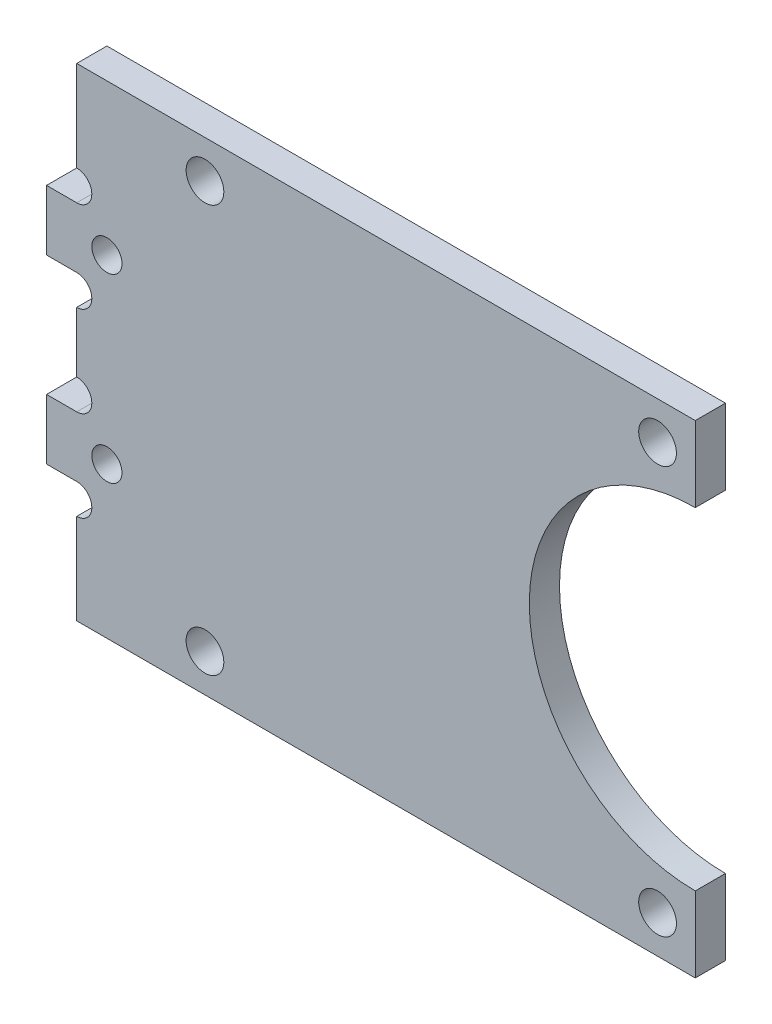
ISO-10303-21;
HEADER;
FILE_DESCRIPTION(('STEP AP214'),'2;1');
FILE_NAME('part.step','',(''),(''),'','','');
FILE_SCHEMA(('AUTOMOTIVE_DESIGN { 1 0 10303 214 1 1 1 1 }'));
ENDSEC;
DATA;
#1=APPLICATION_CONTEXT('core data for automotive mechanical design processes');
#2=APPLICATION_PROTOCOL_DEFINITION('international standard','automotive_design',2000,#1);
#3=PRODUCT_CONTEXT('',#1,'mechanical');
#4=PRODUCT('Part','Part','',(#3));
#5=PRODUCT_RELATED_PRODUCT_CATEGORY('part','',(#4));
#6=PRODUCT_DEFINITION_FORMATION('','',#4);
#7=PRODUCT_DEFINITION_CONTEXT('part definition',#1,'design');
#8=PRODUCT_DEFINITION('design','',#6,#7);
#9=PRODUCT_DEFINITION_SHAPE('','',#8);
#10=(LENGTH_UNIT() NAMED_UNIT(*) SI_UNIT(.MILLI.,.METRE.));
#11=(NAMED_UNIT(*) PLANE_ANGLE_UNIT() SI_UNIT($,.RADIAN.));
#12=(NAMED_UNIT(*) SI_UNIT($,.STERADIAN.) SOLID_ANGLE_UNIT());
#13=UNCERTAINTY_MEASURE_WITH_UNIT(LENGTH_MEASURE(1.E-05),#10,'distance_accuracy_value','');
#14=(GEOMETRIC_REPRESENTATION_CONTEXT(3) GLOBAL_UNCERTAINTY_ASSIGNED_CONTEXT((#13)) GLOBAL_UNIT_ASSIGNED_CONTEXT((#10,
#11,#12)) REPRESENTATION_CONTEXT('',''));
#15=CARTESIAN_POINT('',(0.,0.,0.));
#16=DIRECTION('',(0.,0.,1.));
#17=DIRECTION('',(1.,0.,0.));
#18=AXIS2_PLACEMENT_3D('',#15,#16,#17);
#19=CARTESIAN_POINT('',(15.2837868020581,10.1625,2.));
#20=DIRECTION('',(-1.,0.,0.));
#21=DIRECTION('',(0.,-1.,0.));
#22=AXIS2_PLACEMENT_3D('',#19,#20,#21);
#23=PLANE('',#22);
#24=DIRECTION('',(0.,1.,0.));
#25=VECTOR('',#24,1.);
#26=CARTESIAN_POINT('',(15.2837868020581,10.1625,2.));
#27=LINE('',#26,#25);
#28=CARTESIAN_POINT('',(15.2837868020581,5.1625,2.));
#29=VERTEX_POINT('',#28);
#30=CARTESIAN_POINT('',(15.2837868020581,10.1625,2.));
#31=VERTEX_POINT('',#30);
#32=EDGE_CURVE('E55',#29,#31,#27,.T.);
#33=ORIENTED_EDGE('',*,*,#32,.F.);
#34=DIRECTION('',(0.,0.,-1.));
#35=VECTOR('',#34,1.);
#36=CARTESIAN_POINT('',(15.2837868020581,5.1625,10.));
#37=LINE('',#36,#35);
#38=CARTESIAN_POINT('',(15.2837868020581,5.1625,0.));
#39=VERTEX_POINT('',#38);
#40=EDGE_CURVE('E11',#29,#39,#37,.T.);
#41=ORIENTED_EDGE('',*,*,#40,.T.);
#42=DIRECTION('',(0.,1.,0.));
#43=VECTOR('',#42,1.);
#44=CARTESIAN_POINT('',(15.2837868020581,10.1625,0.));
#45=LINE('',#44,#43);
#46=CARTESIAN_POINT('',(15.2837868020581,10.1625,0.));
#47=VERTEX_POINT('',#46);
#48=EDGE_CURVE('E113',#39,#47,#45,.T.);
#49=ORIENTED_EDGE('',*,*,#48,.T.);
#50=DIRECTION('',(0.,0.,-1.));
#51=VECTOR('',#50,1.);
#52=CARTESIAN_POINT('',(15.2837868020581,10.1625,2.));
#53=LINE('',#52,#51);
#54=EDGE_CURVE('E190',#31,#47,#53,.T.);
#55=ORIENTED_EDGE('',*,*,#54,.F.);
#56=EDGE_LOOP('',(#33,#41,#49,#55));
#57=FACE_BOUND('',#56,.T.);
#58=ADVANCED_FACE('F32',(#57),#23,.F.);
#59=CARTESIAN_POINT('',(-25.7162131979419,3.1625,2.));
#60=DIRECTION('',(0.,0.,1.));
#61=DIRECTION('',(1.,0.,0.));
#62=AXIS2_PLACEMENT_3D('',#59,#60,#61);
#63=PLANE('',#62);
#64=CARTESIAN_POINT('',(15.2837868020581,-5.8375,2.));
#65=DIRECTION('',(0.,0.,1.));
#66=DIRECTION('',(1.,0.,0.));
#67=AXIS2_PLACEMENT_3D('',#64,#65,#66);
#68=CIRCLE('',#67,11.);
#69=CARTESIAN_POINT('',(15.2837868020581,-16.8375,2.));
#70=VERTEX_POINT('',#69);
#71=EDGE_CURVE('E47',#29,#70,#68,.T.);
#72=ORIENTED_EDGE('',*,*,#71,.F.);
#73=ORIENTED_EDGE('',*,*,#32,.T.);
#74=DIRECTION('',(-1.,0.,0.));
#75=VECTOR('',#74,1.);
#76=CARTESIAN_POINT('',(-17.2162131979419,10.1625,2.));
#77=LINE('',#76,#75);
#78=CARTESIAN_POINT('',(-25.7162131979419,10.1625,2.));
#79=VERTEX_POINT('',#78);
#80=EDGE_CURVE('E118',#31,#79,#77,.T.);
#81=ORIENTED_EDGE('',*,*,#80,.T.);
#82=DIRECTION('',(0.,-1.,0.));
#83=VECTOR('',#82,1.);
#84=CARTESIAN_POINT('',(-25.7162131979419,10.1625,2.));
#85=LINE('',#84,#83);
#86=CARTESIAN_POINT('',(-25.7162131979419,4.1625,2.));
#87=VERTEX_POINT('',#86);
#88=EDGE_CURVE('E291',#79,#87,#85,.T.);
#89=ORIENTED_EDGE('',*,*,#88,.T.);
#90=CARTESIAN_POINT('',(-25.7162131979419,3.1625,2.));
#91=DIRECTION('',(0.,0.,-1.));
#92=DIRECTION('',(1.,0.,0.));
#93=AXIS2_PLACEMENT_3D('',#90,#91,#92);
#94=CIRCLE('',#93,1.);
#95=CARTESIAN_POINT('',(-25.7162131979419,2.1625,2.));
#96=VERTEX_POINT('',#95);
#97=EDGE_CURVE('E288',#87,#96,#94,.T.);
#98=ORIENTED_EDGE('',*,*,#97,.T.);
#99=DIRECTION('',(-1.,0.,0.));
#100=VECTOR('',#99,1.);
#101=CARTESIAN_POINT('',(-25.7162131979419,2.1625,2.));
#102=LINE('',#101,#100);
#103=CARTESIAN_POINT('',(-27.7162131979419,2.1625,2.));
#104=VERTEX_POINT('',#103);
#105=EDGE_CURVE('E290',#96,#104,#102,.T.);
#106=ORIENTED_EDGE('',*,*,#105,.T.);
#107=DIRECTION('',(0.,-1.,0.));
#108=VECTOR('',#107,1.);
#109=CARTESIAN_POINT('',(-27.7162131979419,2.1625,2.));
#110=LINE('',#109,#108);
#111=CARTESIAN_POINT('',(-27.7162131979419,-1.8375,2.));
#112=VERTEX_POINT('',#111);
#113=EDGE_CURVE('E293',#104,#112,#110,.T.);
#114=ORIENTED_EDGE('',*,*,#113,.T.);
#115=DIRECTION('',(1.,0.,0.));
#116=VECTOR('',#115,1.);
#117=CARTESIAN_POINT('',(-25.7162131979419,-1.8375,2.));
#118=LINE('',#117,#116);
#119=CARTESIAN_POINT('',(-25.7162131979419,-1.8375,2.));
#120=VERTEX_POINT('',#119);
#121=EDGE_CURVE('E299',#112,#120,#118,.T.);
#122=ORIENTED_EDGE('',*,*,#121,.T.);
#123=CARTESIAN_POINT('',(-25.7162131979419,-2.8375,2.));
#124=DIRECTION('',(0.,0.,-1.));
#125=DIRECTION('',(-1.,0.,0.));
#126=AXIS2_PLACEMENT_3D('',#123,#124,#125);
#127=CIRCLE('',#126,1.);
#128=CARTESIAN_POINT('',(-25.7162131979419,-3.8375,2.));
#129=VERTEX_POINT('',#128);
#130=EDGE_CURVE('E301',#120,#129,#127,.T.);
#131=ORIENTED_EDGE('',*,*,#130,.T.);
#132=DIRECTION('',(0.,-1.,0.));
#133=VECTOR('',#132,1.);
#134=CARTESIAN_POINT('',(-25.7162131979419,-3.8375,2.));
#135=LINE('',#134,#133);
#136=CARTESIAN_POINT('',(-25.7162131979419,-7.8375,2.));
#137=VERTEX_POINT('',#136);
#138=EDGE_CURVE('E303',#129,#137,#135,.T.);
#139=ORIENTED_EDGE('',*,*,#138,.T.);
#140=CARTESIAN_POINT('',(-25.7162131979419,-8.8375,2.));
#141=DIRECTION('',(0.,0.,-1.));
#142=DIRECTION('',(1.,0.,0.));
#143=AXIS2_PLACEMENT_3D('',#140,#141,#142);
#144=CIRCLE('',#143,1.);
#145=CARTESIAN_POINT('',(-25.7162131979419,-9.8375,2.));
#146=VERTEX_POINT('',#145);
#147=EDGE_CURVE('E305',#137,#146,#144,.T.);
#148=ORIENTED_EDGE('',*,*,#147,.T.);
#149=DIRECTION('',(-1.,0.,0.));
#150=VECTOR('',#149,1.);
#151=CARTESIAN_POINT('',(-25.7162131979419,-9.8375,2.));
#152=LINE('',#151,#150);
#153=CARTESIAN_POINT('',(-27.7162131979419,-9.8375,2.));
#154=VERTEX_POINT('',#153);
#155=EDGE_CURVE('E307',#146,#154,#152,.T.);
#156=ORIENTED_EDGE('',*,*,#155,.T.);
#157=DIRECTION('',(0.,-1.,0.));
#158=VECTOR('',#157,1.);
#159=CARTESIAN_POINT('',(-27.7162131979419,-9.8375,2.));
#160=LINE('',#159,#158);
#161=CARTESIAN_POINT('',(-27.7162131979419,-13.8375,2.));
#162=VERTEX_POINT('',#161);
#163=EDGE_CURVE('E309',#154,#162,#160,.T.);
#164=ORIENTED_EDGE('',*,*,#163,.T.);
#165=DIRECTION('',(1.,0.,0.));
#166=VECTOR('',#165,1.);
#167=CARTESIAN_POINT('',(-25.7162131979419,-13.8375,2.));
#168=LINE('',#167,#166);
#169=CARTESIAN_POINT('',(-25.7162131979419,-13.8375,2.));
#170=VERTEX_POINT('',#169);
#171=EDGE_CURVE('E311',#162,#170,#168,.T.);
#172=ORIENTED_EDGE('',*,*,#171,.T.);
#173=CARTESIAN_POINT('',(-25.7162131979419,-14.8375,2.));
#174=DIRECTION('',(0.,0.,-1.));
#175=DIRECTION('',(-1.,0.,0.));
#176=AXIS2_PLACEMENT_3D('',#173,#174,#175);
#177=CIRCLE('',#176,0.999999999999999);
#178=CARTESIAN_POINT('',(-25.7162131979419,-15.8375,2.));
#179=VERTEX_POINT('',#178);
#180=EDGE_CURVE('E167',#170,#179,#177,.T.);
#181=ORIENTED_EDGE('',*,*,#180,.T.);
#182=DIRECTION('',(0.,-1.,0.));
#183=VECTOR('',#182,1.);
#184=CARTESIAN_POINT('',(-25.7162131979419,-15.8375,2.));
#185=LINE('',#184,#183);
#186=CARTESIAN_POINT('',(-25.7162131979419,-21.8375,2.));
#187=VERTEX_POINT('',#186);
#188=EDGE_CURVE('E158',#179,#187,#185,.T.);
#189=ORIENTED_EDGE('',*,*,#188,.T.);
#190=DIRECTION('',(1.,0.,0.));
#191=VECTOR('',#190,1.);
#192=CARTESIAN_POINT('',(-19.7162131979419,-21.8375,2.));
#193=LINE('',#192,#191);
#194=CARTESIAN_POINT('',(15.2837868020581,-21.8375,2.));
#195=VERTEX_POINT('',#194);
#196=EDGE_CURVE('E164',#187,#195,#193,.T.);
#197=ORIENTED_EDGE('',*,*,#196,.T.);
#198=EDGE_CURVE('E186',#195,#70,#27,.T.);
#199=ORIENTED_EDGE('',*,*,#198,.T.);
#200=EDGE_LOOP('',(#72,#73,#81,#89,#98,#106,#114,#122,#131,#139,#148,#156,#164,#172,#181,#189,
#197,#199));
#201=FACE_BOUND('',#200,.T.);
#202=CARTESIAN_POINT('',(-23.7162131979419,0.162500000000001,2.));
#203=DIRECTION('',(0.,0.,1.));
#204=DIRECTION('',(1.,0.,0.));
#205=AXIS2_PLACEMENT_3D('',#202,#203,#204);
#206=CIRCLE('',#205,1.);
#207=CARTESIAN_POINT('',(-22.7162131979419,0.162500000000001,2.));
#208=VERTEX_POINT('',#207);
#209=EDGE_CURVE('E330',#208,#208,#206,.T.);
#210=ORIENTED_EDGE('',*,*,#209,.F.);
#211=EDGE_LOOP('',(#210));
#212=FACE_BOUND('',#211,.T.);
#213=CARTESIAN_POINT('',(12.7837868020581,7.6625,2.));
#214=DIRECTION('',(0.,0.,1.));
#215=DIRECTION('',(1.,0.,0.));
#216=AXIS2_PLACEMENT_3D('',#213,#214,#215);
#217=CIRCLE('',#216,1.25);
#218=CARTESIAN_POINT('',(14.0337868020581,7.6625,2.));
#219=VERTEX_POINT('',#218);
#220=EDGE_CURVE('E342',#219,#219,#217,.T.);
#221=ORIENTED_EDGE('',*,*,#220,.F.);
#222=EDGE_LOOP('',(#221));
#223=FACE_BOUND('',#222,.T.);
#224=CARTESIAN_POINT('',(-17.2162131979419,7.6625,2.));
#225=DIRECTION('',(0.,0.,1.));
#226=DIRECTION('',(1.,0.,0.));
#227=AXIS2_PLACEMENT_3D('',#224,#225,#226);
#228=CIRCLE('',#227,1.25);
#229=CARTESIAN_POINT('',(-15.9662131979419,7.6625,2.));
#230=VERTEX_POINT('',#229);
#231=EDGE_CURVE('E194',#230,#230,#228,.T.);
#232=ORIENTED_EDGE('',*,*,#231,.F.);
#233=EDGE_LOOP('',(#232));
#234=FACE_BOUND('',#233,.T.);
#235=CARTESIAN_POINT('',(12.7837868020581,-19.3375,2.));
#236=DIRECTION('',(0.,0.,1.));
#237=DIRECTION('',(1.,0.,0.));
#238=AXIS2_PLACEMENT_3D('',#235,#236,#237);
#239=CIRCLE('',#238,1.25);
#240=CARTESIAN_POINT('',(14.0337868020581,-19.3375,2.));
#241=VERTEX_POINT('',#240);
#242=EDGE_CURVE('E348',#241,#241,#239,.T.);
#243=ORIENTED_EDGE('',*,*,#242,.F.);
#244=EDGE_LOOP('',(#243));
#245=FACE_BOUND('',#244,.T.);
#246=CARTESIAN_POINT('',(-17.2162131979419,-19.3375,2.));
#247=DIRECTION('',(0.,0.,1.));
#248=DIRECTION('',(1.,0.,0.));
#249=AXIS2_PLACEMENT_3D('',#246,#247,#248);
#250=CIRCLE('',#249,1.25);
#251=CARTESIAN_POINT('',(-15.9662131979419,-19.3375,2.));
#252=VERTEX_POINT('',#251);
#253=EDGE_CURVE('E336',#252,#252,#250,.T.);
#254=ORIENTED_EDGE('',*,*,#253,.F.);
#255=EDGE_LOOP('',(#254));
#256=FACE_BOUND('',#255,.T.);
#257=CARTESIAN_POINT('',(-23.7162131979419,-11.8375,2.));
#258=DIRECTION('',(0.,0.,1.));
#259=DIRECTION('',(1.,0.,0.));
#260=AXIS2_PLACEMENT_3D('',#257,#258,#259);
#261=CIRCLE('',#260,1.);
#262=CARTESIAN_POINT('',(-22.7162131979419,-11.8375,2.));
#263=VERTEX_POINT('',#262);
#264=EDGE_CURVE('E324',#263,#263,#261,.T.);
#265=ORIENTED_EDGE('',*,*,#264,.F.);
#266=EDGE_LOOP('',(#265));
#267=FACE_BOUND('',#266,.T.);
#268=ADVANCED_FACE('F160',(#201,#212,#223,#234,#245,#256,#267),#63,.T.);
#269=CARTESIAN_POINT('',(-25.7162131979419,3.1625,0.));
#270=DIRECTION('',(0.,0.,1.));
#271=DIRECTION('',(1.,0.,0.));
#272=AXIS2_PLACEMENT_3D('',#269,#270,#271);
#273=PLANE('',#272);
#274=ORIENTED_EDGE('',*,*,#48,.F.);
#275=CARTESIAN_POINT('',(15.2837868020581,-5.8375,0.));
#276=DIRECTION('',(0.,0.,-1.));
#277=DIRECTION('',(1.,0.,0.));
#278=AXIS2_PLACEMENT_3D('',#275,#276,#277);
#279=CIRCLE('',#278,11.);
#280=CARTESIAN_POINT('',(15.2837868020581,-16.8375,0.));
#281=VERTEX_POINT('',#280);
#282=EDGE_CURVE('E269',#281,#39,#279,.T.);
#283=ORIENTED_EDGE('',*,*,#282,.F.);
#284=CARTESIAN_POINT('',(15.2837868020581,-21.8375,0.));
#285=VERTEX_POINT('',#284);
#286=EDGE_CURVE('E219',#285,#281,#45,.T.);
#287=ORIENTED_EDGE('',*,*,#286,.F.);
#288=DIRECTION('',(1.,0.,0.));
#289=VECTOR('',#288,1.);
#290=CARTESIAN_POINT('',(15.2837868020581,-21.8375,0.));
#291=LINE('',#290,#289);
#292=CARTESIAN_POINT('',(-25.7162131979419,-21.8375,0.));
#293=VERTEX_POINT('',#292);
#294=EDGE_CURVE('E217',#293,#285,#291,.T.);
#295=ORIENTED_EDGE('',*,*,#294,.F.);
#296=DIRECTION('',(0.,-1.,0.));
#297=VECTOR('',#296,1.);
#298=CARTESIAN_POINT('',(-25.7162131979419,-15.8375,0.));
#299=LINE('',#298,#297);
#300=CARTESIAN_POINT('',(-25.7162131979419,-15.8375,0.));
#301=VERTEX_POINT('',#300);
#302=EDGE_CURVE('E177',#301,#293,#299,.T.);
#303=ORIENTED_EDGE('',*,*,#302,.F.);
#304=CARTESIAN_POINT('',(-25.7162131979419,-14.8375,0.));
#305=DIRECTION('',(0.,0.,-1.));
#306=DIRECTION('',(-1.,0.,0.));
#307=AXIS2_PLACEMENT_3D('',#304,#305,#306);
#308=CIRCLE('',#307,0.999999999999999);
#309=CARTESIAN_POINT('',(-25.7162131979419,-13.8375,0.));
#310=VERTEX_POINT('',#309);
#311=EDGE_CURVE('E214',#310,#301,#308,.T.);
#312=ORIENTED_EDGE('',*,*,#311,.F.);
#313=DIRECTION('',(1.,0.,0.));
#314=VECTOR('',#313,1.);
#315=CARTESIAN_POINT('',(-25.7162131979419,-13.8375,0.));
#316=LINE('',#315,#314);
#317=CARTESIAN_POINT('',(-27.7162131979419,-13.8375,0.));
#318=VERTEX_POINT('',#317);
#319=EDGE_CURVE('E212',#318,#310,#316,.T.);
#320=ORIENTED_EDGE('',*,*,#319,.F.);
#321=DIRECTION('',(0.,-1.,0.));
#322=VECTOR('',#321,1.);
#323=CARTESIAN_POINT('',(-27.7162131979419,-9.8375,0.));
#324=LINE('',#323,#322);
#325=CARTESIAN_POINT('',(-27.7162131979419,-9.8375,0.));
#326=VERTEX_POINT('',#325);
#327=EDGE_CURVE('E210',#326,#318,#324,.T.);
#328=ORIENTED_EDGE('',*,*,#327,.F.);
#329=DIRECTION('',(-1.,0.,0.));
#330=VECTOR('',#329,1.);
#331=CARTESIAN_POINT('',(-25.7162131979419,-9.8375,0.));
#332=LINE('',#331,#330);
#333=CARTESIAN_POINT('',(-25.7162131979419,-9.8375,0.));
#334=VERTEX_POINT('',#333);
#335=EDGE_CURVE('E208',#334,#326,#332,.T.);
#336=ORIENTED_EDGE('',*,*,#335,.F.);
#337=CARTESIAN_POINT('',(-25.7162131979419,-8.8375,0.));
#338=DIRECTION('',(0.,0.,-1.));
#339=DIRECTION('',(1.,0.,0.));
#340=AXIS2_PLACEMENT_3D('',#337,#338,#339);
#341=CIRCLE('',#340,1.);
#342=CARTESIAN_POINT('',(-25.7162131979419,-7.8375,0.));
#343=VERTEX_POINT('',#342);
#344=EDGE_CURVE('E206',#343,#334,#341,.T.);
#345=ORIENTED_EDGE('',*,*,#344,.F.);
#346=DIRECTION('',(0.,-1.,0.));
#347=VECTOR('',#346,1.);
#348=CARTESIAN_POINT('',(-25.7162131979419,-3.8375,0.));
#349=LINE('',#348,#347);
#350=CARTESIAN_POINT('',(-25.7162131979419,-3.8375,0.));
#351=VERTEX_POINT('',#350);
#352=EDGE_CURVE('E204',#351,#343,#349,.T.);
#353=ORIENTED_EDGE('',*,*,#352,.F.);
#354=CARTESIAN_POINT('',(-25.7162131979419,-2.8375,0.));
#355=DIRECTION('',(0.,0.,-1.));
#356=DIRECTION('',(-1.,0.,0.));
#357=AXIS2_PLACEMENT_3D('',#354,#355,#356);
#358=CIRCLE('',#357,1.);
#359=CARTESIAN_POINT('',(-25.7162131979419,-1.8375,0.));
#360=VERTEX_POINT('',#359);
#361=EDGE_CURVE('E202',#360,#351,#358,.T.);
#362=ORIENTED_EDGE('',*,*,#361,.F.);
#363=DIRECTION('',(1.,0.,0.));
#364=VECTOR('',#363,1.);
#365=CARTESIAN_POINT('',(-25.7162131979419,-1.8375,0.));
#366=LINE('',#365,#364);
#367=CARTESIAN_POINT('',(-27.7162131979419,-1.8375,0.));
#368=VERTEX_POINT('',#367);
#369=EDGE_CURVE('E200',#368,#360,#366,.T.);
#370=ORIENTED_EDGE('',*,*,#369,.F.);
#371=DIRECTION('',(0.,-1.,0.));
#372=VECTOR('',#371,1.);
#373=CARTESIAN_POINT('',(-27.7162131979419,2.1625,0.));
#374=LINE('',#373,#372);
#375=CARTESIAN_POINT('',(-27.7162131979419,2.1625,0.));
#376=VERTEX_POINT('',#375);
#377=EDGE_CURVE('E198',#376,#368,#374,.T.);
#378=ORIENTED_EDGE('',*,*,#377,.F.);
#379=DIRECTION('',(-1.,0.,0.));
#380=VECTOR('',#379,1.);
#381=CARTESIAN_POINT('',(-25.7162131979419,2.1625,0.));
#382=LINE('',#381,#380);
#383=CARTESIAN_POINT('',(-25.7162131979419,2.1625,0.));
#384=VERTEX_POINT('',#383);
#385=EDGE_CURVE('E196',#384,#376,#382,.T.);
#386=ORIENTED_EDGE('',*,*,#385,.F.);
#387=CARTESIAN_POINT('',(-25.7162131979419,3.1625,0.));
#388=DIRECTION('',(0.,0.,-1.));
#389=DIRECTION('',(1.,0.,0.));
#390=AXIS2_PLACEMENT_3D('',#387,#388,#389);
#391=CIRCLE('',#390,1.);
#392=CARTESIAN_POINT('',(-25.7162131979419,4.1625,0.));
#393=VERTEX_POINT('',#392);
#394=EDGE_CURVE('E193',#393,#384,#391,.T.);
#395=ORIENTED_EDGE('',*,*,#394,.F.);
#396=DIRECTION('',(0.,-1.,0.));
#397=VECTOR('',#396,1.);
#398=CARTESIAN_POINT('',(-25.7162131979419,10.1625,0.));
#399=LINE('',#398,#397);
#400=CARTESIAN_POINT('',(-25.7162131979419,10.1625,0.));
#401=VERTEX_POINT('',#400);
#402=EDGE_CURVE('E191',#401,#393,#399,.T.);
#403=ORIENTED_EDGE('',*,*,#402,.F.);
#404=DIRECTION('',(-1.,0.,0.));
#405=VECTOR('',#404,1.);
#406=CARTESIAN_POINT('',(-17.2162131979419,10.1625,0.));
#407=LINE('',#406,#405);
#408=EDGE_CURVE('E222',#47,#401,#407,.T.);
#409=ORIENTED_EDGE('',*,*,#408,.F.);
#410=EDGE_LOOP('',(#274,#283,#287,#295,#303,#312,#320,#328,#336,#345,#353,#362,#370,#378,#386,
#395,#403,#409));
#411=FACE_BOUND('',#410,.T.);
#412=CARTESIAN_POINT('',(-17.2162131979419,7.6625,0.));
#413=DIRECTION('',(0.,0.,1.));
#414=DIRECTION('',(1.,0.,0.));
#415=AXIS2_PLACEMENT_3D('',#412,#413,#414);
#416=CIRCLE('',#415,1.25);
#417=CARTESIAN_POINT('',(-15.9662131979419,7.6625,0.));
#418=VERTEX_POINT('',#417);
#419=EDGE_CURVE('E351',#418,#418,#416,.T.);
#420=ORIENTED_EDGE('',*,*,#419,.T.);
#421=EDGE_LOOP('',(#420));
#422=FACE_BOUND('',#421,.T.);
#423=CARTESIAN_POINT('',(12.7837868020581,-19.3375,0.));
#424=DIRECTION('',(0.,0.,1.));
#425=DIRECTION('',(1.,0.,0.));
#426=AXIS2_PLACEMENT_3D('',#423,#424,#425);
#427=CIRCLE('',#426,1.25);
#428=CARTESIAN_POINT('',(14.0337868020581,-19.3375,0.));
#429=VERTEX_POINT('',#428);
#430=EDGE_CURVE('E345',#429,#429,#427,.T.);
#431=ORIENTED_EDGE('',*,*,#430,.T.);
#432=EDGE_LOOP('',(#431));
#433=FACE_BOUND('',#432,.T.);
#434=CARTESIAN_POINT('',(12.7837868020581,7.6625,0.));
#435=DIRECTION('',(0.,0.,1.));
#436=DIRECTION('',(1.,0.,0.));
#437=AXIS2_PLACEMENT_3D('',#434,#435,#436);
#438=CIRCLE('',#437,1.25);
#439=CARTESIAN_POINT('',(14.0337868020581,7.6625,0.));
#440=VERTEX_POINT('',#439);
#441=EDGE_CURVE('E339',#440,#440,#438,.T.);
#442=ORIENTED_EDGE('',*,*,#441,.T.);
#443=EDGE_LOOP('',(#442));
#444=FACE_BOUND('',#443,.T.);
#445=CARTESIAN_POINT('',(-17.2162131979419,-19.3375,0.));
#446=DIRECTION('',(0.,0.,1.));
#447=DIRECTION('',(1.,0.,0.));
#448=AXIS2_PLACEMENT_3D('',#445,#446,#447);
#449=CIRCLE('',#448,1.25);
#450=CARTESIAN_POINT('',(-15.9662131979419,-19.3375,0.));
#451=VERTEX_POINT('',#450);
#452=EDGE_CURVE('E333',#451,#451,#449,.T.);
#453=ORIENTED_EDGE('',*,*,#452,.T.);
#454=EDGE_LOOP('',(#453));
#455=FACE_BOUND('',#454,.T.);
#456=CARTESIAN_POINT('',(-23.7162131979419,0.162500000000001,0.));
#457=DIRECTION('',(0.,0.,1.));
#458=DIRECTION('',(1.,0.,0.));
#459=AXIS2_PLACEMENT_3D('',#456,#457,#458);
#460=CIRCLE('',#459,1.);
#461=CARTESIAN_POINT('',(-22.7162131979419,0.162500000000001,0.));
#462=VERTEX_POINT('',#461);
#463=EDGE_CURVE('E327',#462,#462,#460,.T.);
#464=ORIENTED_EDGE('',*,*,#463,.T.);
#465=EDGE_LOOP('',(#464));
#466=FACE_BOUND('',#465,.T.);
#467=CARTESIAN_POINT('',(-23.7162131979419,-11.8375,0.));
#468=DIRECTION('',(0.,0.,1.));
#469=DIRECTION('',(1.,0.,0.));
#470=AXIS2_PLACEMENT_3D('',#467,#468,#469);
#471=CIRCLE('',#470,1.);
#472=CARTESIAN_POINT('',(-22.7162131979419,-11.8375,0.));
#473=VERTEX_POINT('',#472);
#474=EDGE_CURVE('E268',#473,#473,#471,.T.);
#475=ORIENTED_EDGE('',*,*,#474,.T.);
#476=EDGE_LOOP('',(#475));
#477=FACE_BOUND('',#476,.T.);
#478=ADVANCED_FACE('F277',(#411,#422,#433,#444,#455,#466,#477),#273,.F.);
#479=CARTESIAN_POINT('',(-25.7162131979419,10.1625,2.));
#480=DIRECTION('',(1.,0.,0.));
#481=DIRECTION('',(0.,0.,-1.));
#482=AXIS2_PLACEMENT_3D('',#479,#480,#481);
#483=PLANE('',#482);
#484=ORIENTED_EDGE('',*,*,#402,.T.);
#485=DIRECTION('',(0.,0.,-1.));
#486=VECTOR('',#485,1.);
#487=CARTESIAN_POINT('',(-25.7162131979419,4.1625,2.));
#488=LINE('',#487,#486);
#489=EDGE_CURVE('E257',#87,#393,#488,.T.);
#490=ORIENTED_EDGE('',*,*,#489,.F.);
#491=ORIENTED_EDGE('',*,*,#88,.F.);
#492=DIRECTION('',(0.,0.,-1.));
#493=VECTOR('',#492,1.);
#494=CARTESIAN_POINT('',(-25.7162131979419,10.1625,2.));
#495=LINE('',#494,#493);
#496=EDGE_CURVE('E260',#79,#401,#495,.T.);
#497=ORIENTED_EDGE('',*,*,#496,.T.);
#498=EDGE_LOOP('',(#484,#490,#491,#497));
#499=FACE_BOUND('',#498,.T.);
#500=ADVANCED_FACE('F34',(#499),#483,.F.);
#501=CARTESIAN_POINT('',(-25.7162131979419,3.1625,2.));
#502=DIRECTION('',(0.,0.,-1.));
#503=DIRECTION('',(-1.,0.,0.));
#504=AXIS2_PLACEMENT_3D('',#501,#502,#503);
#505=CYLINDRICAL_SURFACE('',#504,1.);
#506=ORIENTED_EDGE('',*,*,#394,.T.);
#507=DIRECTION('',(0.,0.,-1.));
#508=VECTOR('',#507,1.);
#509=CARTESIAN_POINT('',(-25.7162131979419,2.1625,2.));
#510=LINE('',#509,#508);
#511=EDGE_CURVE('E254',#96,#384,#510,.T.);
#512=ORIENTED_EDGE('',*,*,#511,.F.);
#513=ORIENTED_EDGE('',*,*,#97,.F.);
#514=ORIENTED_EDGE('',*,*,#489,.T.);
#515=EDGE_LOOP('',(#506,#512,#513,#514));
#516=FACE_BOUND('',#515,.T.);
#517=ADVANCED_FACE('F286',(#516),#505,.F.);
#518=CARTESIAN_POINT('',(-25.7162131979419,2.1625,2.));
#519=DIRECTION('',(0.,-1.,0.));
#520=DIRECTION('',(0.,0.,-1.));
#521=AXIS2_PLACEMENT_3D('',#518,#519,#520);
#522=PLANE('',#521);
#523=ORIENTED_EDGE('',*,*,#385,.T.);
#524=DIRECTION('',(0.,0.,-1.));
#525=VECTOR('',#524,1.);
#526=CARTESIAN_POINT('',(-27.7162131979419,2.1625,2.));
#527=LINE('',#526,#525);
#528=EDGE_CURVE('E251',#104,#376,#527,.T.);
#529=ORIENTED_EDGE('',*,*,#528,.F.);
#530=ORIENTED_EDGE('',*,*,#105,.F.);
#531=ORIENTED_EDGE('',*,*,#511,.T.);
#532=EDGE_LOOP('',(#523,#529,#530,#531));
#533=FACE_BOUND('',#532,.T.);
#534=ADVANCED_FACE('F420',(#533),#522,.F.);
#535=CARTESIAN_POINT('',(-27.7162131979419,2.1625,2.));
#536=DIRECTION('',(1.,0.,0.));
#537=DIRECTION('',(0.,0.,-1.));
#538=AXIS2_PLACEMENT_3D('',#535,#536,#537);
#539=PLANE('',#538);
#540=ORIENTED_EDGE('',*,*,#377,.T.);
#541=DIRECTION('',(0.,0.,-1.));
#542=VECTOR('',#541,1.);
#543=CARTESIAN_POINT('',(-27.7162131979419,-1.8375,2.));
#544=LINE('',#543,#542);
#545=EDGE_CURVE('E248',#112,#368,#544,.T.);
#546=ORIENTED_EDGE('',*,*,#545,.F.);
#547=ORIENTED_EDGE('',*,*,#113,.F.);
#548=ORIENTED_EDGE('',*,*,#528,.T.);
#549=EDGE_LOOP('',(#540,#546,#547,#548));
#550=FACE_BOUND('',#549,.T.);
#551=ADVANCED_FACE('F416',(#550),#539,.F.);
#552=CARTESIAN_POINT('',(-25.7162131979419,-1.8375,2.));
#553=DIRECTION('',(0.,1.,0.));
#554=DIRECTION('',(0.,0.,1.));
#555=AXIS2_PLACEMENT_3D('',#552,#553,#554);
#556=PLANE('',#555);
#557=ORIENTED_EDGE('',*,*,#369,.T.);
#558=DIRECTION('',(0.,0.,-1.));
#559=VECTOR('',#558,1.);
#560=CARTESIAN_POINT('',(-25.7162131979419,-1.8375,2.));
#561=LINE('',#560,#559);
#562=EDGE_CURVE('E245',#120,#360,#561,.T.);
#563=ORIENTED_EDGE('',*,*,#562,.F.);
#564=ORIENTED_EDGE('',*,*,#121,.F.);
#565=ORIENTED_EDGE('',*,*,#545,.T.);
#566=EDGE_LOOP('',(#557,#563,#564,#565));
#567=FACE_BOUND('',#566,.T.);
#568=ADVANCED_FACE('F412',(#567),#556,.F.);
#569=CARTESIAN_POINT('',(-25.7162131979419,-2.8375,2.));
#570=DIRECTION('',(0.,0.,-1.));
#571=DIRECTION('',(-1.,0.,0.));
#572=AXIS2_PLACEMENT_3D('',#569,#570,#571);
#573=CYLINDRICAL_SURFACE('',#572,1.);
#574=ORIENTED_EDGE('',*,*,#361,.T.);
#575=DIRECTION('',(0.,0.,-1.));
#576=VECTOR('',#575,1.);
#577=CARTESIAN_POINT('',(-25.7162131979419,-3.8375,2.));
#578=LINE('',#577,#576);
#579=EDGE_CURVE('E242',#129,#351,#578,.T.);
#580=ORIENTED_EDGE('',*,*,#579,.F.);
#581=ORIENTED_EDGE('',*,*,#130,.F.);
#582=ORIENTED_EDGE('',*,*,#562,.T.);
#583=EDGE_LOOP('',(#574,#580,#581,#582));
#584=FACE_BOUND('',#583,.T.);
#585=ADVANCED_FACE('F408',(#584),#573,.F.);
#586=CARTESIAN_POINT('',(-25.7162131979419,-3.8375,2.));
#587=DIRECTION('',(1.,0.,0.));
#588=DIRECTION('',(0.,0.,-1.));
#589=AXIS2_PLACEMENT_3D('',#586,#587,#588);
#590=PLANE('',#589);
#591=ORIENTED_EDGE('',*,*,#352,.T.);
#592=DIRECTION('',(0.,0.,-1.));
#593=VECTOR('',#592,1.);
#594=CARTESIAN_POINT('',(-25.7162131979419,-7.8375,2.));
#595=LINE('',#594,#593);
#596=EDGE_CURVE('E239',#137,#343,#595,.T.);
#597=ORIENTED_EDGE('',*,*,#596,.F.);
#598=ORIENTED_EDGE('',*,*,#138,.F.);
#599=ORIENTED_EDGE('',*,*,#579,.T.);
#600=EDGE_LOOP('',(#591,#597,#598,#599));
#601=FACE_BOUND('',#600,.T.);
#602=ADVANCED_FACE('F404',(#601),#590,.F.);
#603=CARTESIAN_POINT('',(-25.7162131979419,-8.8375,2.));
#604=DIRECTION('',(0.,0.,-1.));
#605=DIRECTION('',(-1.,0.,0.));
#606=AXIS2_PLACEMENT_3D('',#603,#604,#605);
#607=CYLINDRICAL_SURFACE('',#606,1.);
#608=ORIENTED_EDGE('',*,*,#344,.T.);
#609=DIRECTION('',(0.,0.,-1.));
#610=VECTOR('',#609,1.);
#611=CARTESIAN_POINT('',(-25.7162131979419,-9.8375,2.));
#612=LINE('',#611,#610);
#613=EDGE_CURVE('E236',#146,#334,#612,.T.);
#614=ORIENTED_EDGE('',*,*,#613,.F.);
#615=ORIENTED_EDGE('',*,*,#147,.F.);
#616=ORIENTED_EDGE('',*,*,#596,.T.);
#617=EDGE_LOOP('',(#608,#614,#615,#616));
#618=FACE_BOUND('',#617,.T.);
#619=ADVANCED_FACE('F400',(#618),#607,.F.);
#620=CARTESIAN_POINT('',(-25.7162131979419,-9.8375,2.));
#621=DIRECTION('',(0.,-1.,0.));
#622=DIRECTION('',(0.,0.,-1.));
#623=AXIS2_PLACEMENT_3D('',#620,#621,#622);
#624=PLANE('',#623);
#625=ORIENTED_EDGE('',*,*,#335,.T.);
#626=DIRECTION('',(0.,0.,-1.));
#627=VECTOR('',#626,1.);
#628=CARTESIAN_POINT('',(-27.7162131979419,-9.8375,2.));
#629=LINE('',#628,#627);
#630=EDGE_CURVE('E233',#154,#326,#629,.T.);
#631=ORIENTED_EDGE('',*,*,#630,.F.);
#632=ORIENTED_EDGE('',*,*,#155,.F.);
#633=ORIENTED_EDGE('',*,*,#613,.T.);
#634=EDGE_LOOP('',(#625,#631,#632,#633));
#635=FACE_BOUND('',#634,.T.);
#636=ADVANCED_FACE('F396',(#635),#624,.F.);
#637=CARTESIAN_POINT('',(-27.7162131979419,-9.8375,2.));
#638=DIRECTION('',(1.,0.,0.));
#639=DIRECTION('',(0.,0.,-1.));
#640=AXIS2_PLACEMENT_3D('',#637,#638,#639);
#641=PLANE('',#640);
#642=ORIENTED_EDGE('',*,*,#327,.T.);
#643=DIRECTION('',(0.,0.,-1.));
#644=VECTOR('',#643,1.);
#645=CARTESIAN_POINT('',(-27.7162131979419,-13.8375,2.));
#646=LINE('',#645,#644);
#647=EDGE_CURVE('E230',#162,#318,#646,.T.);
#648=ORIENTED_EDGE('',*,*,#647,.F.);
#649=ORIENTED_EDGE('',*,*,#163,.F.);
#650=ORIENTED_EDGE('',*,*,#630,.T.);
#651=EDGE_LOOP('',(#642,#648,#649,#650));
#652=FACE_BOUND('',#651,.T.);
#653=ADVANCED_FACE('F393',(#652),#641,.F.);
#654=CARTESIAN_POINT('',(-25.7162131979419,-13.8375,2.));
#655=DIRECTION('',(0.,1.,0.));
#656=DIRECTION('',(0.,0.,1.));
#657=AXIS2_PLACEMENT_3D('',#654,#655,#656);
#658=PLANE('',#657);
#659=ORIENTED_EDGE('',*,*,#319,.T.);
#660=DIRECTION('',(0.,0.,-1.));
#661=VECTOR('',#660,1.);
#662=CARTESIAN_POINT('',(-25.7162131979419,-13.8375,2.));
#663=LINE('',#662,#661);
#664=EDGE_CURVE('E227',#170,#310,#663,.T.);
#665=ORIENTED_EDGE('',*,*,#664,.F.);
#666=ORIENTED_EDGE('',*,*,#171,.F.);
#667=ORIENTED_EDGE('',*,*,#647,.T.);
#668=EDGE_LOOP('',(#659,#665,#666,#667));
#669=FACE_BOUND('',#668,.T.);
#670=ADVANCED_FACE('F317',(#669),#658,.F.);
#671=CARTESIAN_POINT('',(-25.7162131979419,-14.8375,2.));
#672=DIRECTION('',(0.,0.,-1.));
#673=DIRECTION('',(-1.,0.,0.));
#674=AXIS2_PLACEMENT_3D('',#671,#672,#673);
#675=CYLINDRICAL_SURFACE('',#674,0.999999999999999);
#676=ORIENTED_EDGE('',*,*,#311,.T.);
#677=DIRECTION('',(0.,0.,-1.));
#678=VECTOR('',#677,1.);
#679=CARTESIAN_POINT('',(-25.7162131979419,-15.8375,2.));
#680=LINE('',#679,#678);
#681=EDGE_CURVE('E179',#179,#301,#680,.T.);
#682=ORIENTED_EDGE('',*,*,#681,.F.);
#683=ORIENTED_EDGE('',*,*,#180,.F.);
#684=ORIENTED_EDGE('',*,*,#664,.T.);
#685=EDGE_LOOP('',(#676,#682,#683,#684));
#686=FACE_BOUND('',#685,.T.);
#687=ADVANCED_FACE('F321',(#686),#675,.F.);
#688=CARTESIAN_POINT('',(-25.7162131979419,-15.8375,2.));
#689=DIRECTION('',(1.,0.,0.));
#690=DIRECTION('',(0.,1.,0.));
#691=AXIS2_PLACEMENT_3D('',#688,#689,#690);
#692=PLANE('',#691);
#693=ORIENTED_EDGE('',*,*,#302,.T.);
#694=DIRECTION('',(0.,0.,-1.));
#695=VECTOR('',#694,1.);
#696=CARTESIAN_POINT('',(-25.7162131979419,-21.8375,2.));
#697=LINE('',#696,#695);
#698=EDGE_CURVE('E174',#187,#293,#697,.T.);
#699=ORIENTED_EDGE('',*,*,#698,.F.);
#700=ORIENTED_EDGE('',*,*,#188,.F.);
#701=ORIENTED_EDGE('',*,*,#681,.T.);
#702=EDGE_LOOP('',(#693,#699,#700,#701));
#703=FACE_BOUND('',#702,.T.);
#704=ADVANCED_FACE('F175',(#703),#692,.F.);
#705=CARTESIAN_POINT('',(15.2837868020581,-21.8375,2.));
#706=DIRECTION('',(0.,1.,0.));
#707=DIRECTION('',(-1.,0.,0.));
#708=AXIS2_PLACEMENT_3D('',#705,#706,#707);
#709=PLANE('',#708);
#710=ORIENTED_EDGE('',*,*,#294,.T.);
#711=DIRECTION('',(0.,0.,-1.));
#712=VECTOR('',#711,1.);
#713=CARTESIAN_POINT('',(15.2837868020581,-21.8375,2.));
#714=LINE('',#713,#712);
#715=EDGE_CURVE('E180',#195,#285,#714,.T.);
#716=ORIENTED_EDGE('',*,*,#715,.F.);
#717=ORIENTED_EDGE('',*,*,#196,.F.);
#718=ORIENTED_EDGE('',*,*,#698,.T.);
#719=EDGE_LOOP('',(#710,#716,#717,#718));
#720=FACE_BOUND('',#719,.T.);
#721=ADVANCED_FACE('F182',(#720),#709,.F.);
#722=ORIENTED_EDGE('',*,*,#286,.T.);
#723=DIRECTION('',(0.,0.,-1.));
#724=VECTOR('',#723,1.);
#725=CARTESIAN_POINT('',(15.2837868020581,-16.8375,10.));
#726=LINE('',#725,#724);
#727=EDGE_CURVE('E40',#281,#70,#726,.F.);
#728=ORIENTED_EDGE('',*,*,#727,.T.);
#729=ORIENTED_EDGE('',*,*,#198,.F.);
#730=ORIENTED_EDGE('',*,*,#715,.T.);
#731=EDGE_LOOP('',(#722,#728,#729,#730));
#732=FACE_BOUND('',#731,.T.);
#733=ADVANCED_FACE('F263',(#732),#23,.F.);
#734=CARTESIAN_POINT('',(-17.2162131979419,10.1625,2.));
#735=DIRECTION('',(0.,-1.,0.));
#736=DIRECTION('',(0.,0.,-1.));
#737=AXIS2_PLACEMENT_3D('',#734,#735,#736);
#738=PLANE('',#737);
#739=ORIENTED_EDGE('',*,*,#408,.T.);
#740=ORIENTED_EDGE('',*,*,#496,.F.);
#741=ORIENTED_EDGE('',*,*,#80,.F.);
#742=ORIENTED_EDGE('',*,*,#54,.T.);
#743=EDGE_LOOP('',(#739,#740,#741,#742));
#744=FACE_BOUND('',#743,.T.);
#745=ADVANCED_FACE('F274',(#744),#738,.F.);
#746=CARTESIAN_POINT('',(-17.2162131979419,7.6625,2.));
#747=DIRECTION('',(0.,0.,-1.));
#748=DIRECTION('',(-1.,0.,0.));
#749=AXIS2_PLACEMENT_3D('',#746,#747,#748);
#750=CYLINDRICAL_SURFACE('',#749,1.25);
#751=ORIENTED_EDGE('',*,*,#231,.T.);
#752=EDGE_LOOP('',(#751));
#753=FACE_BOUND('',#752,.T.);
#754=ORIENTED_EDGE('',*,*,#419,.F.);
#755=EDGE_LOOP('',(#754));
#756=FACE_BOUND('',#755,.T.);
#757=ADVANCED_FACE('F360',(#753,#756),#750,.F.);
#758=CARTESIAN_POINT('',(12.7837868020581,-19.3375,2.));
#759=DIRECTION('',(0.,0.,-1.));
#760=DIRECTION('',(-1.,0.,0.));
#761=AXIS2_PLACEMENT_3D('',#758,#759,#760);
#762=CYLINDRICAL_SURFACE('',#761,1.25);
#763=ORIENTED_EDGE('',*,*,#242,.T.);
#764=EDGE_LOOP('',(#763));
#765=FACE_BOUND('',#764,.T.);
#766=ORIENTED_EDGE('',*,*,#430,.F.);
#767=EDGE_LOOP('',(#766));
#768=FACE_BOUND('',#767,.T.);
#769=ADVANCED_FACE('F362',(#765,#768),#762,.F.);
#770=CARTESIAN_POINT('',(12.7837868020581,7.6625,2.));
#771=DIRECTION('',(0.,0.,-1.));
#772=DIRECTION('',(-1.,0.,0.));
#773=AXIS2_PLACEMENT_3D('',#770,#771,#772);
#774=CYLINDRICAL_SURFACE('',#773,1.25);
#775=ORIENTED_EDGE('',*,*,#220,.T.);
#776=EDGE_LOOP('',(#775));
#777=FACE_BOUND('',#776,.T.);
#778=ORIENTED_EDGE('',*,*,#441,.F.);
#779=EDGE_LOOP('',(#778));
#780=FACE_BOUND('',#779,.T.);
#781=ADVANCED_FACE('F369',(#777,#780),#774,.F.);
#782=CARTESIAN_POINT('',(-17.2162131979419,-19.3375,2.));
#783=DIRECTION('',(0.,0.,-1.));
#784=DIRECTION('',(-1.,0.,0.));
#785=AXIS2_PLACEMENT_3D('',#782,#783,#784);
#786=CYLINDRICAL_SURFACE('',#785,1.25);
#787=ORIENTED_EDGE('',*,*,#253,.T.);
#788=EDGE_LOOP('',(#787));
#789=FACE_BOUND('',#788,.T.);
#790=ORIENTED_EDGE('',*,*,#452,.F.);
#791=EDGE_LOOP('',(#790));
#792=FACE_BOUND('',#791,.T.);
#793=ADVANCED_FACE('F465',(#789,#792),#786,.F.);
#794=CARTESIAN_POINT('',(-23.7162131979419,0.162500000000001,2.));
#795=DIRECTION('',(0.,0.,-1.));
#796=DIRECTION('',(-1.,0.,0.));
#797=AXIS2_PLACEMENT_3D('',#794,#795,#796);
#798=CYLINDRICAL_SURFACE('',#797,1.);
#799=ORIENTED_EDGE('',*,*,#209,.T.);
#800=EDGE_LOOP('',(#799));
#801=FACE_BOUND('',#800,.T.);
#802=ORIENTED_EDGE('',*,*,#463,.F.);
#803=EDGE_LOOP('',(#802));
#804=FACE_BOUND('',#803,.T.);
#805=ADVANCED_FACE('F454',(#801,#804),#798,.F.);
#806=CARTESIAN_POINT('',(-23.7162131979419,-11.8375,2.));
#807=DIRECTION('',(0.,0.,-1.));
#808=DIRECTION('',(-1.,0.,0.));
#809=AXIS2_PLACEMENT_3D('',#806,#807,#808);
#810=CYLINDRICAL_SURFACE('',#809,1.);
#811=ORIENTED_EDGE('',*,*,#264,.T.);
#812=EDGE_LOOP('',(#811));
#813=FACE_BOUND('',#812,.T.);
#814=ORIENTED_EDGE('',*,*,#474,.F.);
#815=EDGE_LOOP('',(#814));
#816=FACE_BOUND('',#815,.T.);
#817=ADVANCED_FACE('F449',(#813,#816),#810,.F.);
#818=CARTESIAN_POINT('',(15.2837868020581,-5.8375,10.));
#819=DIRECTION('',(0.,0.,-1.));
#820=DIRECTION('',(-1.,0.,0.));
#821=AXIS2_PLACEMENT_3D('',#818,#819,#820);
#822=CYLINDRICAL_SURFACE('',#821,11.);
#823=ORIENTED_EDGE('',*,*,#71,.T.);
#824=ORIENTED_EDGE('',*,*,#727,.F.);
#825=ORIENTED_EDGE('',*,*,#282,.T.);
#826=ORIENTED_EDGE('',*,*,#40,.F.);
#827=EDGE_LOOP('',(#823,#824,#825,#826));
#828=FACE_BOUND('',#827,.T.);
#829=ADVANCED_FACE('F453',(#828),#822,.F.);
#830=CLOSED_SHELL('',(#58,#268,#478,#500,#517,#534,#551,#568,#585,#602,#619,#636,#653,#670,#687,
#704,#721,#733,#745,#757,#769,#781,#793,#805,#817,#829));
#831=MANIFOLD_SOLID_BREP('B2',#830);
#832=ADVANCED_BREP_SHAPE_REPRESENTATION('',(#18,#831),#14);
#833=SHAPE_DEFINITION_REPRESENTATION(#9,#832);
ENDSEC;
END-ISO-10303-21;
